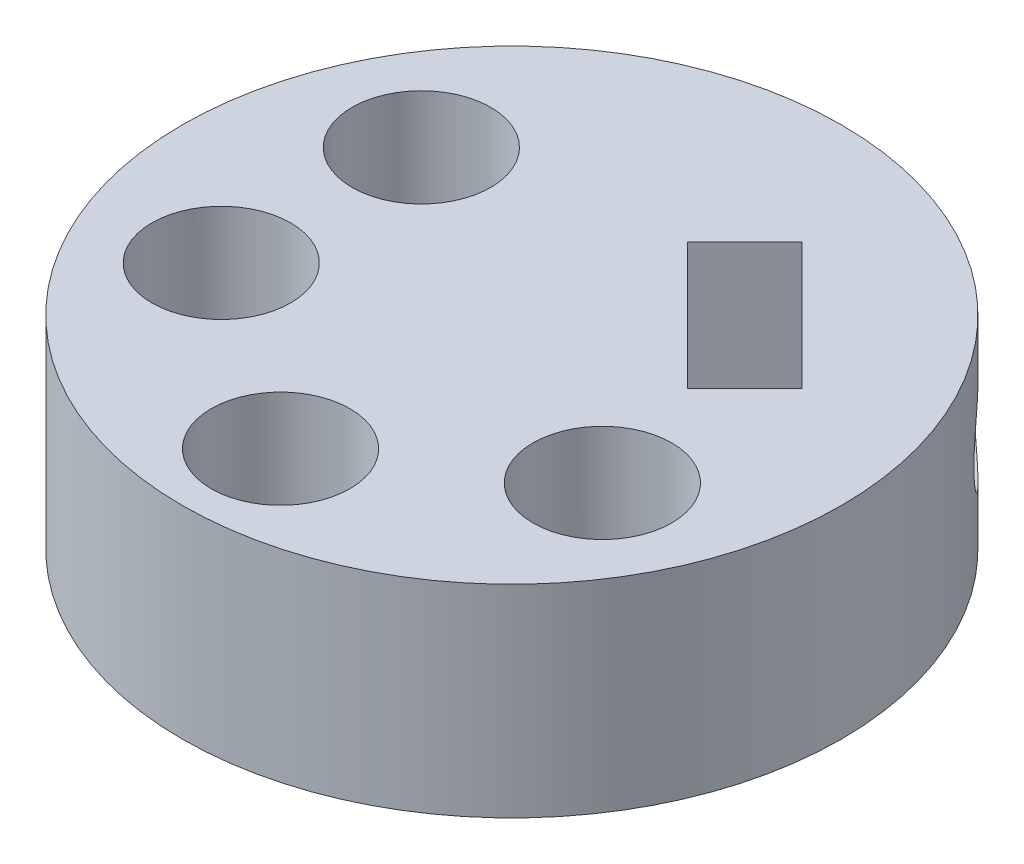
ISO-10303-21;
HEADER;
FILE_DESCRIPTION(('STEP AP214'),'2;1');
FILE_NAME('part.step','',(''),(''),'','','');
FILE_SCHEMA(('AUTOMOTIVE_DESIGN { 1 0 10303 214 1 1 1 1 }'));
ENDSEC;
DATA;
#1=APPLICATION_CONTEXT('core data for automotive mechanical design processes');
#2=APPLICATION_PROTOCOL_DEFINITION('international standard','automotive_design',2000,#1);
#3=PRODUCT_CONTEXT('',#1,'mechanical');
#4=PRODUCT('Part','Part','',(#3));
#5=PRODUCT_RELATED_PRODUCT_CATEGORY('part','',(#4));
#6=PRODUCT_DEFINITION_FORMATION('','',#4);
#7=PRODUCT_DEFINITION_CONTEXT('part definition',#1,'design');
#8=PRODUCT_DEFINITION('design','',#6,#7);
#9=PRODUCT_DEFINITION_SHAPE('','',#8);
#10=(LENGTH_UNIT() NAMED_UNIT(*) SI_UNIT(.MILLI.,.METRE.));
#11=(NAMED_UNIT(*) PLANE_ANGLE_UNIT() SI_UNIT($,.RADIAN.));
#12=(NAMED_UNIT(*) SI_UNIT($,.STERADIAN.) SOLID_ANGLE_UNIT());
#13=UNCERTAINTY_MEASURE_WITH_UNIT(LENGTH_MEASURE(1.E-05),#10,'distance_accuracy_value','');
#14=(GEOMETRIC_REPRESENTATION_CONTEXT(3) GLOBAL_UNCERTAINTY_ASSIGNED_CONTEXT((#13)) GLOBAL_UNIT_ASSIGNED_CONTEXT((#10,
#11,#12)) REPRESENTATION_CONTEXT('',''));
#15=CARTESIAN_POINT('',(0.,0.,0.));
#16=DIRECTION('',(0.,0.,1.));
#17=DIRECTION('',(1.,0.,0.));
#18=AXIS2_PLACEMENT_3D('',#15,#16,#17);
#19=CARTESIAN_POINT('',(0.,7.,0.));
#20=DIRECTION('',(0.,-1.,0.));
#21=DIRECTION('',(0.,0.,-1.));
#22=AXIS2_PLACEMENT_3D('',#19,#20,#21);
#23=CYLINDRICAL_SURFACE('',#22,11.4);
#24=CARTESIAN_POINT('',(0.,7.,0.));
#25=DIRECTION('',(0.,1.,0.));
#26=DIRECTION('',(0.,0.,1.));
#27=AXIS2_PLACEMENT_3D('',#24,#25,#26);
#28=CIRCLE('',#27,11.4);
#29=CARTESIAN_POINT('',(0.,7.,11.4));
#30=VERTEX_POINT('',#29);
#31=EDGE_CURVE('E44',#30,#30,#28,.T.);
#32=ORIENTED_EDGE('',*,*,#31,.F.);
#33=EDGE_LOOP('',(#32));
#34=FACE_BOUND('',#33,.T.);
#35=CARTESIAN_POINT('',(0.,0.,0.));
#36=DIRECTION('',(0.,1.,0.));
#37=DIRECTION('',(0.,0.,1.));
#38=AXIS2_PLACEMENT_3D('',#35,#36,#37);
#39=CIRCLE('',#38,11.4);
#40=CARTESIAN_POINT('',(0.,0.,11.4));
#41=VERTEX_POINT('',#40);
#42=EDGE_CURVE('E144',#41,#41,#39,.T.);
#43=ORIENTED_EDGE('',*,*,#42,.T.);
#44=EDGE_LOOP('',(#43));
#45=FACE_BOUND('',#44,.T.);
#46=CARTESIAN_POINT('',(9.05159253290014,3.5,-6.9302721893405));
#47=CARTESIAN_POINT('',(9.05159091847496,3.41613655358143,-6.93027558480712));
#48=CARTESIAN_POINT('',(9.04726983660078,3.33222160706658,-6.9359293469926));
#49=CARTESIAN_POINT('',(9.03004610210006,3.16672973025324,-6.9583374025146));
#50=CARTESIAN_POINT('',(9.01713462882855,3.08515529309842,-6.97510310556428));
#51=CARTESIAN_POINT('',(8.98295479463834,2.92676429581512,-7.01906642155657));
#52=CARTESIAN_POINT('',(8.96169228739024,2.84994444651783,-7.04625672703986));
#53=CARTESIAN_POINT('',(8.91117771226029,2.70315790664436,-7.11003226333646));
#54=CARTESIAN_POINT('',(8.88192694447024,2.6331901034109,-7.14661596531379));
#55=CARTESIAN_POINT('',(8.81576454481025,2.50164739761795,-7.22807415121351));
#56=CARTESIAN_POINT('',(8.77881145435356,2.44012103313957,-7.27299335206226));
#57=CARTESIAN_POINT('',(8.69803587209957,2.32762732792228,-7.36940424984137));
#58=CARTESIAN_POINT('',(8.65421303016286,2.27666052569366,-7.42089628175275));
#59=CARTESIAN_POINT('',(8.56041863023652,2.18655724547279,-7.52890160341992));
#60=CARTESIAN_POINT('',(8.51042508085664,2.14746490443057,-7.58543264027919));
#61=CARTESIAN_POINT('',(8.4055514761673,2.08250306353681,-7.70148127732598));
#62=CARTESIAN_POINT('',(8.35067162111511,2.05663302208345,-7.76099875507549));
#63=CARTESIAN_POINT('',(8.23772806990656,2.01899573287759,-7.88077211519033));
#64=CARTESIAN_POINT('',(8.17968467131051,2.00714761293946,-7.94102171820398));
#65=CARTESIAN_POINT('',(8.0616988426531,1.99763973863863,-8.06077385456071));
#66=CARTESIAN_POINT('',(8.00175649501416,1.99997936930444,-8.12027642017227));
#67=CARTESIAN_POINT('',(7.88208783425085,2.01871601511722,-8.23648027403859));
#68=CARTESIAN_POINT('',(7.82236247607553,2.03502604748125,-8.29319660439726));
#69=CARTESIAN_POINT('',(7.70456614628883,2.08110440427941,-8.40274564385622));
#70=CARTESIAN_POINT('',(7.64649520899176,2.11087300764187,-8.45557827244057));
#71=CARTESIAN_POINT('',(7.53367293162005,2.1831151312878,-8.55625570602068));
#72=CARTESIAN_POINT('',(7.47893193917763,2.22562604118072,-8.60408526559659));
#73=CARTESIAN_POINT('',(7.37475119326877,2.32211882754777,-8.6935474453925));
#74=CARTESIAN_POINT('',(7.32531170924802,2.3761012866405,-8.73517975068283));
#75=CARTESIAN_POINT('',(7.23306652608383,2.49449135221085,-8.8117180800022));
#76=CARTESIAN_POINT('',(7.19031389126532,2.55897480109748,-8.84657078694514));
#77=CARTESIAN_POINT('',(7.11343202254933,2.69627657141711,-8.9085088478789));
#78=CARTESIAN_POINT('',(7.07930282122379,2.76909492433073,-8.93559417253126));
#79=CARTESIAN_POINT('',(7.02093144062578,2.92106927246061,-8.9815315391548));
#80=CARTESIAN_POINT('',(6.99669423384223,3.00022843120364,-9.00037944069028));
#81=CARTESIAN_POINT('',(6.95908008972639,3.16260063688995,-9.02949474195526));
#82=CARTESIAN_POINT('',(6.945702570273,3.24581346628738,-9.03976260160894));
#83=CARTESIAN_POINT('',(6.93040178829282,3.4132653376371,-9.05149848798732));
#84=CARTESIAN_POINT('',(6.92839370876661,3.49749207039499,-9.05303167664478));
#85=CARTESIAN_POINT('',(6.93568480057464,3.66516386773742,-9.04744696625406));
#86=CARTESIAN_POINT('',(6.94498370413855,3.74860895078572,-9.04032927207483));
#87=CARTESIAN_POINT('',(6.97446063828485,3.91202830719241,-9.01760718911021));
#88=CARTESIAN_POINT('',(6.99459758152611,3.99201446415777,-9.00203485020377));
#89=CARTESIAN_POINT('',(7.04494519242043,4.14661795444828,-8.96268721018388));
#90=CARTESIAN_POINT('',(7.07515624995963,4.22123507984646,-8.93891159158769));
#91=CARTESIAN_POINT('',(7.14473007808337,4.3634611276858,-8.88340118756214));
#92=CARTESIAN_POINT('',(7.18414524051834,4.43102659866182,-8.85162075224688));
#93=CARTESIAN_POINT('',(7.27060718159523,4.55678723735425,-8.78073962346713));
#94=CARTESIAN_POINT('',(7.31765428987619,4.61498200011459,-8.74163861380112));
#95=CARTESIAN_POINT('',(7.41806831359355,4.72072387317372,-8.65659346363933));
#96=CARTESIAN_POINT('',(7.47147340000758,4.76820114914965,-8.61060751549677));
#97=CARTESIAN_POINT('',(7.58255371286342,4.85067631927852,-8.51295133444978));
#98=CARTESIAN_POINT('',(7.64022884534603,4.88567448792646,-8.46128122660892));
#99=CARTESIAN_POINT('',(7.75778931407933,4.94208356799221,-8.35362397232892));
#100=CARTESIAN_POINT('',(7.8176676201069,4.96353430028569,-8.29765002567945));
#101=CARTESIAN_POINT('',(7.9379157843879,4.99236899093024,-8.18268952133261));
#102=CARTESIAN_POINT('',(7.9982856178034,4.99975365569299,-8.12370311507668));
#103=CARTESIAN_POINT('',(8.11726312590987,5.0002323942286,-8.00481476719155));
#104=CARTESIAN_POINT('',(8.17588066366004,4.99343394089013,-7.94492310021061));
#105=CARTESIAN_POINT('',(8.2902104910731,4.96596772302318,-7.82555064296877));
#106=CARTESIAN_POINT('',(8.34592278434432,4.94529997572088,-7.76606985219764));
#107=CARTESIAN_POINT('',(8.45300523151407,4.89071671102614,-7.64937751446562));
#108=CARTESIAN_POINT('',(8.50437724915076,4.85680691537203,-7.59216499915388));
#109=CARTESIAN_POINT('',(8.60162535289329,4.77671329964869,-7.48180843129918));
#110=CARTESIAN_POINT('',(8.64750134524512,4.73052927024253,-7.4286644481649));
#111=CARTESIAN_POINT('',(8.73311202743531,4.62680263362888,-7.3278351071094));
#112=CARTESIAN_POINT('',(8.77279982765575,4.56918017681008,-7.28019207533688));
#113=CARTESIAN_POINT('',(8.84487229692681,4.44437917781099,-7.19245899194787));
#114=CARTESIAN_POINT('',(8.87725523892188,4.37719838190403,-7.1523707268396));
#115=CARTESIAN_POINT('',(8.93424258281471,4.2348554249973,-7.08105983089272));
#116=CARTESIAN_POINT('',(8.95881311120705,4.15966034529438,-7.04987586577567));
#117=CARTESIAN_POINT('',(8.99953490319017,4.00369548074757,-6.99781919890452));
#118=CARTESIAN_POINT('',(9.01569522171167,3.92293179797287,-6.97693540864366));
#119=CARTESIAN_POINT('',(9.03552679685597,3.78480251735314,-6.95121705873816));
#120=CARTESIAN_POINT('',(9.0415459419166,3.72830408776817,-6.94337749326108));
#121=CARTESIAN_POINT('',(9.04957934375292,3.61454511070304,-6.93290392172734));
#122=CARTESIAN_POINT('',(9.05159363566489,3.55728456991363,-6.93026987000051));
#123=CARTESIAN_POINT('',(9.05159253290014,3.5,-6.9302721893405));
#124=B_SPLINE_CURVE_WITH_KNOTS('',3,(#46,#47,#48,#49,#50,#51,#52,#53,#54,#55,#56,#57,#58,#59,
#60,#61,#62,#63,#64,#65,#66,#67,#68,#69,#70,#71,#72,#73,#74,#75,#76,#77,#78,#79,#80,#81,#82,#83,
#84,#85,#86,#87,#88,#89,#90,#91,#92,#93,#94,#95,#96,#97,#98,#99,#100,#101,#102,#103,#104,#105,
#106,#107,#108,#109,#110,#111,#112,#113,#114,#115,#116,#117,#118,#119,#120,#121,#122,#123),
.UNSPECIFIED.,.T.,.F.,(4,2,2,2,2,2,2,2,2,2,2,2,2,2,2,2,2,2,2,2,2,2,2,2,2,2,2,2,2,2,2,2,2,2,2,2,
2,2,4),(0.,0.251381043086059,0.50302060431444,0.754484092287202,1.00590667886643,
1.25871923908628,1.51154468891916,1.76529869577428,2.01904230771713,2.27131519481672,
2.52357714716506,2.77427978413757,3.02498761715016,3.27643842334439,3.5279020033094,
3.78126962067335,4.03463819502882,4.28813397581192,4.54161616734654,4.7932048429059,
5.04478756049499,5.29542316993415,5.54606848054282,5.79817688215687,6.05029617573803,
6.30401366278498,6.55772556862479,6.81068820828677,7.06363814358227,7.31467830916664,
7.56571816295019,7.81664966507906,8.06758544711693,8.32033881089727,8.57315186956023,
8.82704659622807,9.08066739628107,9.25237964868446,9.42409039457667),.UNSPECIFIED.);
#125=CARTESIAN_POINT('',(9.05159253290014,3.5,-6.9302721893405));
#126=VERTEX_POINT('',#125);
#127=EDGE_CURVE('E184',#126,#126,#124,.T.);
#128=ORIENTED_EDGE('',*,*,#127,.F.);
#129=EDGE_LOOP('',(#128));
#130=FACE_BOUND('',#129,.T.);
#131=ADVANCED_FACE('F35',(#34,#45,#130),#23,.T.);
#132=CARTESIAN_POINT('',(0.,-4.,0.));
#133=DIRECTION('',(0.,1.,0.));
#134=DIRECTION('',(0.,0.,1.));
#135=AXIS2_PLACEMENT_3D('',#132,#133,#134);
#136=CYLINDRICAL_SURFACE('',#135,2.);
#137=CARTESIAN_POINT('',(0.,6.,0.));
#138=DIRECTION('',(0.,-1.,0.));
#139=DIRECTION('',(0.,0.,-1.));
#140=AXIS2_PLACEMENT_3D('',#137,#138,#139);
#141=CIRCLE('',#140,2.);
#142=CARTESIAN_POINT('',(0.,6.,-2.));
#143=VERTEX_POINT('',#142);
#144=EDGE_CURVE('E113',#143,#143,#141,.T.);
#145=ORIENTED_EDGE('',*,*,#144,.F.);
#146=EDGE_LOOP('',(#145));
#147=FACE_BOUND('',#146,.T.);
#148=CARTESIAN_POINT('',(0.,-2.,0.));
#149=DIRECTION('',(0.,-1.,0.));
#150=DIRECTION('',(0.,0.,-1.));
#151=AXIS2_PLACEMENT_3D('',#148,#149,#150);
#152=CIRCLE('',#151,2.);
#153=CARTESIAN_POINT('',(0.,-2.,-2.));
#154=VERTEX_POINT('',#153);
#155=EDGE_CURVE('E116',#154,#154,#152,.F.);
#156=ORIENTED_EDGE('',*,*,#155,.F.);
#157=EDGE_LOOP('',(#156));
#158=FACE_BOUND('',#157,.T.);
#159=CARTESIAN_POINT('',(-0.125245825086334,3.5,-1.99607451847331));
#160=CARTESIAN_POINT('',(-0.125228816046949,3.56999742342563,-1.99608048320406));
#161=CARTESIAN_POINT('',(-0.117717315842087,3.64004583431192,-1.99659007099343));
#162=CARTESIAN_POINT('',(-0.0890084037695492,3.77732985620948,-1.99806439961621));
#163=CARTESIAN_POINT('',(-0.0677701985889207,3.84455644501951,-1.9990304947993));
#164=CARTESIAN_POINT('',(-0.0149108390067836,3.97357984673838,-2.00011493620575));
#165=CARTESIAN_POINT('',(0.016563020339923,4.03543877676246,-2.00024479481793));
#166=CARTESIAN_POINT('',(0.0873686977741222,4.15434545444519,-1.99840475194135));
#167=CARTESIAN_POINT('',(0.126699566034246,4.21139378246922,-1.99643510413554));
#168=CARTESIAN_POINT('',(0.220174689159699,4.33211279631659,-1.98850605208671));
#169=CARTESIAN_POINT('',(0.275696196789394,4.39466793422648,-1.98179741318454));
#170=CARTESIAN_POINT('',(0.393063458137065,4.51252546624227,-1.96190142873548));
#171=CARTESIAN_POINT('',(0.454918470369642,4.56781696482027,-1.94870448816959));
#172=CARTESIAN_POINT('',(0.59610207011124,4.68085873865547,-1.91076941171501));
#173=CARTESIAN_POINT('',(0.676419706759292,4.73680596671986,-1.88422496597211));
#174=CARTESIAN_POINT('',(0.839787154000621,4.83462220828284,-1.8172770228746));
#175=CARTESIAN_POINT('',(0.922830032668427,4.87652429746881,-1.77690654544456));
#176=CARTESIAN_POINT('',(1.06240924701474,4.93320768590294,-1.69579169489921));
#177=CARTESIAN_POINT('',(1.11938613914939,4.95235709597847,-1.65883231593822));
#178=CARTESIAN_POINT('',(1.23072200434734,4.98139011599675,-1.57798583471889));
#179=CARTESIAN_POINT('',(1.28508321280617,4.99128177610674,-1.53410479014091));
#180=CARTESIAN_POINT('',(1.38949923508118,5.00122173386249,-1.44022013548301));
#181=CARTESIAN_POINT('',(1.43954252303833,5.00124445437644,-1.39020095250482));
#182=CARTESIAN_POINT('',(1.53361435599959,4.99138206321971,-1.28567986952804));
#183=CARTESIAN_POINT('',(1.57764150542561,4.98149465709186,-1.23117693410424));
#184=CARTESIAN_POINT('',(1.65731897614091,4.95291894941013,-1.12148873964273));
#185=CARTESIAN_POINT('',(1.69320455524055,4.93454367361292,-1.06639078392789));
#186=CARTESIAN_POINT('',(1.75822332480261,4.89000435781776,-0.955401883755456));
#187=CARTESIAN_POINT('',(1.78735504044665,4.86383861948684,-0.899510768920694));
#188=CARTESIAN_POINT('',(1.84189110542738,4.80147038485469,-0.782338373366854));
#189=CARTESIAN_POINT('',(1.86655032947433,4.76448790338124,-0.721128723766489));
#190=CARTESIAN_POINT('',(1.9086044337295,4.68326629602949,-0.601068888678106));
#191=CARTESIAN_POINT('',(1.92599307834044,4.6390209863001,-0.542220767489013));
#192=CARTESIAN_POINT('',(1.95728550142884,4.53477665117906,-0.417090905917004));
#193=CARTESIAN_POINT('',(1.96983083943625,4.4733907899736,-0.351624140685937));
#194=CARTESIAN_POINT('',(1.98786690581766,4.34216541637805,-0.228572851990609));
#195=CARTESIAN_POINT('',(1.99335427884002,4.27232190047494,-0.17099208914012));
#196=CARTESIAN_POINT('',(1.99893877369124,4.13901812975437,-0.077401460987198));
#197=CARTESIAN_POINT('',(1.99988512472963,4.07701295469935,-0.0393768881167819));
#198=CARTESIAN_POINT('',(2.00009493538965,3.94793471858062,0.026747416034127));
#199=CARTESIAN_POINT('',(1.99936222259319,3.88087352030963,0.0548695521963898));
#200=CARTESIAN_POINT('',(1.9978767244799,3.75631305600168,0.0937788682225791));
#201=CARTESIAN_POINT('',(1.99715669944154,3.69955291788314,0.106897079351604));
#202=CARTESIAN_POINT('',(1.99621440897796,3.58464453382617,0.12329235587443));
#203=CARTESIAN_POINT('',(1.99599150681249,3.52649816009718,0.126582012018883));
#204=CARTESIAN_POINT('',(1.99621999404621,3.4105210082666,0.122912138502517));
#205=CARTESIAN_POINT('',(1.99667163163691,3.35269035419033,0.115948836361109));
#206=CARTESIAN_POINT('',(1.99788598811695,3.23892384755713,0.0926402408059104));
#207=CARTESIAN_POINT('',(1.99864923731491,3.1829914020519,0.0762789342151893));
#208=CARTESIAN_POINT('',(1.99999296694321,3.05366195506113,0.0281866995243321));
#209=CARTESIAN_POINT('',(2.00039810813187,2.98156404608497,-0.0070048396821432));
#210=CARTESIAN_POINT('',(1.99847283633848,2.84369233635988,-0.0880276046897114));
#211=CARTESIAN_POINT('',(1.99613736088773,2.77793048270525,-0.133878394646303));
#212=CARTESIAN_POINT('',(1.98681489110354,2.65065099195188,-0.235031745864318));
#213=CARTESIAN_POINT('',(1.97966559899619,2.58936712378174,-0.29061221642324));
#214=CARTESIAN_POINT('',(1.95889840514673,2.47399790363875,-0.40775272485017));
#215=CARTESIAN_POINT('',(1.94527735476879,2.41991607201106,-0.469315661694189));
#216=CARTESIAN_POINT('',(1.90624443987176,2.30872300837063,-0.610493164099597));
#217=CARTESIAN_POINT('',(1.87890859152955,2.2535247611424,-0.691115894169927));
#218=CARTESIAN_POINT('',(1.81025180953124,2.15737926654913,-0.854877556836812));
#219=CARTESIAN_POINT('',(1.76896153244335,2.11640117541871,-0.938010612995397));
#220=CARTESIAN_POINT('',(1.68641412370468,2.06156200855313,-1.07723362514677));
#221=CARTESIAN_POINT('',(1.64897643444367,2.04324320672456,-1.13384906327599));
#222=CARTESIAN_POINT('',(1.567278931434,2.01587120369248,-1.24432280791735));
#223=CARTESIAN_POINT('',(1.52302525795132,2.00680971845149,-1.2981835384374));
#224=CARTESIAN_POINT('',(1.42855600233455,1.9984836090714,-1.40147719832668));
#225=CARTESIAN_POINT('',(1.37832669793597,1.99924198265176,-1.45089946056877));
#226=CARTESIAN_POINT('',(1.27355518949044,2.01056099130124,-1.54368272342466));
#227=CARTESIAN_POINT('',(1.2190118400218,2.02112423770748,-1.58704210576838));
#228=CARTESIAN_POINT('',(1.10910552389624,2.05097491616724,-1.66562958182513));
#229=CARTESIAN_POINT('',(1.05381231736778,2.07000018132155,-1.70105718715034));
#230=CARTESIAN_POINT('',(0.942549200572796,2.11578806561894,-1.76514256068928));
#231=CARTESIAN_POINT('',(0.886579148011496,2.14255233983092,-1.7937988784069));
#232=CARTESIAN_POINT('',(0.769069645686687,2.20627793759597,-1.84747494323911));
#233=CARTESIAN_POINT('',(0.707617517599775,2.24405093135959,-1.87171501830846));
#234=CARTESIAN_POINT('',(0.58720993146144,2.32686644055422,-1.91291467177125));
#235=CARTESIAN_POINT('',(0.528256831535114,2.37191563728605,-1.92986750583851));
#236=CARTESIAN_POINT('',(0.403008243576639,2.4780053665608,-1.96023246473189));
#237=CARTESIAN_POINT('',(0.337567339423564,2.54044639943991,-1.97228071818695));
#238=CARTESIAN_POINT('',(0.214895612958091,2.67386807189988,-1.98938366437798));
#239=CARTESIAN_POINT('',(0.157667801797531,2.74485182603657,-1.99443579798034));
#240=CARTESIAN_POINT('',(0.066140153062407,2.87888325059031,-1.99931311842522));
#241=CARTESIAN_POINT('',(0.0295577611532969,2.94033498270656,-2.00003138755796));
#242=CARTESIAN_POINT('',(-0.0337490284660993,3.06808291305589,-1.99996641387897));
#243=CARTESIAN_POINT('',(-0.0604995738005172,3.13436569159546,-1.99918718855739));
#244=CARTESIAN_POINT('',(-0.0952093427142979,3.25078821959693,-1.99778511998958));
#245=CARTESIAN_POINT('',(-0.106377983930113,3.29996707129047,-1.99718335905785));
#246=CARTESIAN_POINT('',(-0.121399936592211,3.39942233303366,-1.99632602865974));
#247=CARTESIAN_POINT('',(-0.125258048231719,3.44969800094373,-1.99607023206009));
#248=CARTESIAN_POINT('',(-0.125245825086334,3.5,-1.99607451847331));
#249=B_SPLINE_CURVE_WITH_KNOTS('',3,(#159,#160,#161,#162,#163,#164,#165,#166,#167,#168,#169,
#170,#171,#172,#173,#174,#175,#176,#177,#178,#179,#180,#181,#182,#183,#184,#185,#186,#187,#188,
#189,#190,#191,#192,#193,#194,#195,#196,#197,#198,#199,#200,#201,#202,#203,#204,#205,#206,#207,
#208,#209,#210,#211,#212,#213,#214,#215,#216,#217,#218,#219,#220,#221,#222,#223,#224,#225,#226,
#227,#228,#229,#230,#231,#232,#233,#234,#235,#236,#237,#238,#239,#240,#241,#242,#243,#244,#245,
#246,#247,#248),.UNSPECIFIED.,.T.,.F.,(4,2,2,2,2,2,2,2,2,2,2,2,2,2,2,2,2,2,2,2,2,2,2,2,2,2,2,2,
2,2,2,2,2,2,2,2,2,2,2,2,2,2,2,2,4),(0.,0.20973177668449,0.420089722582995,0.627545385620139,
0.834975984672346,1.08585208691169,1.33710031031849,1.63964848103538,1.94147907444963,
2.15227725277555,2.36289195870711,2.57405250727807,2.78526195641289,2.9892375589505,
3.19325766108669,3.41936844116895,3.64567274887663,3.91649517204702,4.18744629647933,
4.40499409477197,4.62204646613006,4.79608005545901,4.96989060538193,5.14376512326213,
5.31793678696019,5.55730028202398,5.79710662639151,6.04543209090061,6.29387849446619,
6.59652499511463,6.89851088586565,7.10852896194427,7.31835893539181,7.52868041101044,
7.73905791773945,7.94332812691912,8.14764205379333,8.3751005248961,8.60276905744645,
8.87547580578155,9.14828228208531,9.36218279640836,9.57551025772699,9.72632812073766,
9.87704692032409),.UNSPECIFIED.);
#250=CARTESIAN_POINT('',(-0.125245825086334,3.5,-1.99607451847331));
#251=VERTEX_POINT('',#250);
#252=EDGE_CURVE('E162',#251,#251,#249,.T.);
#253=ORIENTED_EDGE('',*,*,#252,.T.);
#254=EDGE_LOOP('',(#253));
#255=FACE_BOUND('',#254,.T.);
#256=ADVANCED_FACE('F154',(#147,#158,#255),#136,.F.);
#257=CARTESIAN_POINT('',(0.,7.,0.));
#258=DIRECTION('',(0.,1.,0.));
#259=DIRECTION('',(0.,0.,1.));
#260=AXIS2_PLACEMENT_3D('',#257,#258,#259);
#261=PLANE('',#260);
#262=ORIENTED_EDGE('',*,*,#31,.T.);
#263=EDGE_LOOP('',(#262));
#264=FACE_BOUND('',#263,.T.);
#265=CARTESIAN_POINT('',(6.59,7.,3.46));
#266=DIRECTION('',(0.,1.,0.));
#267=DIRECTION('',(0.,0.,1.));
#268=AXIS2_PLACEMENT_3D('',#265,#266,#267);
#269=CIRCLE('',#268,2.4);
#270=CARTESIAN_POINT('',(6.59,7.,5.86));
#271=VERTEX_POINT('',#270);
#272=EDGE_CURVE('E141',#271,#271,#269,.T.);
#273=ORIENTED_EDGE('',*,*,#272,.F.);
#274=EDGE_LOOP('',(#273));
#275=FACE_BOUND('',#274,.T.);
#276=CARTESIAN_POINT('',(-6.59,7.,3.46));
#277=DIRECTION('',(0.,1.,0.));
#278=DIRECTION('',(0.,0.,1.));
#279=AXIS2_PLACEMENT_3D('',#276,#277,#278);
#280=CIRCLE('',#279,2.4);
#281=CARTESIAN_POINT('',(-6.59,7.,5.86));
#282=VERTEX_POINT('',#281);
#283=EDGE_CURVE('E124',#282,#282,#280,.T.);
#284=ORIENTED_EDGE('',*,*,#283,.F.);
#285=EDGE_LOOP('',(#284));
#286=FACE_BOUND('',#285,.T.);
#287=CARTESIAN_POINT('',(0.,7.,8.));
#288=DIRECTION('',(0.,1.,0.));
#289=DIRECTION('',(0.,0.,1.));
#290=AXIS2_PLACEMENT_3D('',#287,#288,#289);
#291=CIRCLE('',#290,2.4);
#292=CARTESIAN_POINT('',(0.,7.,10.4));
#293=VERTEX_POINT('',#292);
#294=EDGE_CURVE('E132',#293,#293,#291,.T.);
#295=ORIENTED_EDGE('',*,*,#294,.F.);
#296=EDGE_LOOP('',(#295));
#297=FACE_BOUND('',#296,.T.);
#298=CARTESIAN_POINT('',(-6.59,7.,-3.46));
#299=DIRECTION('',(0.,1.,0.));
#300=DIRECTION('',(0.,0.,1.));
#301=AXIS2_PLACEMENT_3D('',#298,#299,#300);
#302=CIRCLE('',#301,2.4);
#303=CARTESIAN_POINT('',(-6.59,7.,-1.06));
#304=VERTEX_POINT('',#303);
#305=EDGE_CURVE('E135',#304,#304,#302,.F.);
#306=ORIENTED_EDGE('',*,*,#305,.T.);
#307=EDGE_LOOP('',(#306));
#308=FACE_BOUND('',#307,.T.);
#309=DIRECTION('',(-0.707106781186548,0.,0.707106781186548));
#310=VECTOR('',#309,1.);
#311=CARTESIAN_POINT('',(-2.1920310216783,7.,-2.1920310216783));
#312=LINE('',#311,#310);
#313=CARTESIAN_POINT('',(2.82842712474619,7.,-7.21248916810279));
#314=VERTEX_POINT('',#313);
#315=CARTESIAN_POINT('',(0.848528137423858,7.,-5.23259018078045));
#316=VERTEX_POINT('',#315);
#317=EDGE_CURVE('E108',#314,#316,#312,.T.);
#318=ORIENTED_EDGE('',*,*,#317,.F.);
#319=DIRECTION('',(0.707106781186547,0.,0.707106781186548));
#320=VECTOR('',#319,1.);
#321=CARTESIAN_POINT('',(5.02045814642449,7.,-5.02045814642449));
#322=LINE('',#321,#320);
#323=CARTESIAN_POINT('',(7.21248916810278,7.,-2.82842712474619));
#324=VERTEX_POINT('',#323);
#325=EDGE_CURVE('E110',#314,#324,#322,.T.);
#326=ORIENTED_EDGE('',*,*,#325,.T.);
#327=DIRECTION('',(-0.707106781186548,0.,0.707106781186548));
#328=VECTOR('',#327,1.);
#329=CARTESIAN_POINT('',(2.1920310216783,7.,2.1920310216783));
#330=LINE('',#329,#328);
#331=CARTESIAN_POINT('',(5.23259018078045,7.,-0.848528137423858));
#332=VERTEX_POINT('',#331);
#333=EDGE_CURVE('E103',#324,#332,#330,.T.);
#334=ORIENTED_EDGE('',*,*,#333,.T.);
#335=DIRECTION('',(-0.707106781186548,0.,-0.707106781186548));
#336=VECTOR('',#335,1.);
#337=CARTESIAN_POINT('',(3.04055915910215,7.,-3.04055915910215));
#338=LINE('',#337,#336);
#339=EDGE_CURVE('E84',#332,#316,#338,.T.);
#340=ORIENTED_EDGE('',*,*,#339,.T.);
#341=EDGE_LOOP('',(#318,#326,#334,#340));
#342=FACE_BOUND('',#341,.T.);
#343=ADVANCED_FACE('F157',(#264,#275,#286,#297,#308,#342),#261,.T.);
#344=CARTESIAN_POINT('',(0.,0.,0.));
#345=DIRECTION('',(0.,1.,0.));
#346=DIRECTION('',(0.,0.,1.));
#347=AXIS2_PLACEMENT_3D('',#344,#345,#346);
#348=PLANE('',#347);
#349=CARTESIAN_POINT('',(-6.59,0.,-3.46));
#350=DIRECTION('',(0.,1.,0.));
#351=DIRECTION('',(0.,0.,1.));
#352=AXIS2_PLACEMENT_3D('',#349,#350,#351);
#353=CIRCLE('',#352,2.4);
#354=CARTESIAN_POINT('',(-6.59,0.,-1.06));
#355=VERTEX_POINT('',#354);
#356=EDGE_CURVE('E121',#355,#355,#353,.T.);
#357=ORIENTED_EDGE('',*,*,#356,.T.);
#358=EDGE_LOOP('',(#357));
#359=FACE_BOUND('',#358,.T.);
#360=ORIENTED_EDGE('',*,*,#42,.F.);
#361=EDGE_LOOP('',(#360));
#362=FACE_BOUND('',#361,.T.);
#363=CARTESIAN_POINT('',(6.59,0.,3.46));
#364=DIRECTION('',(0.,-1.,0.));
#365=DIRECTION('',(0.,0.,-1.));
#366=AXIS2_PLACEMENT_3D('',#363,#364,#365);
#367=CIRCLE('',#366,2.4);
#368=CARTESIAN_POINT('',(6.59,0.,1.06));
#369=VERTEX_POINT('',#368);
#370=EDGE_CURVE('E138',#369,#369,#367,.T.);
#371=ORIENTED_EDGE('',*,*,#370,.F.);
#372=EDGE_LOOP('',(#371));
#373=FACE_BOUND('',#372,.T.);
#374=CARTESIAN_POINT('',(-6.59,0.,3.46));
#375=DIRECTION('',(0.,-1.,0.));
#376=DIRECTION('',(0.,0.,-1.));
#377=AXIS2_PLACEMENT_3D('',#374,#375,#376);
#378=CIRCLE('',#377,2.4);
#379=CARTESIAN_POINT('',(-6.59,0.,1.06));
#380=VERTEX_POINT('',#379);
#381=EDGE_CURVE('E120',#380,#380,#378,.T.);
#382=ORIENTED_EDGE('',*,*,#381,.F.);
#383=EDGE_LOOP('',(#382));
#384=FACE_BOUND('',#383,.T.);
#385=CARTESIAN_POINT('',(0.,0.,8.));
#386=DIRECTION('',(0.,-1.,0.));
#387=DIRECTION('',(0.,0.,-1.));
#388=AXIS2_PLACEMENT_3D('',#385,#386,#387);
#389=CIRCLE('',#388,2.4);
#390=CARTESIAN_POINT('',(0.,0.,5.6));
#391=VERTEX_POINT('',#390);
#392=EDGE_CURVE('E125',#391,#391,#389,.T.);
#393=ORIENTED_EDGE('',*,*,#392,.F.);
#394=EDGE_LOOP('',(#393));
#395=FACE_BOUND('',#394,.T.);
#396=CARTESIAN_POINT('',(0.,0.,0.));
#397=DIRECTION('',(0.,1.,0.));
#398=DIRECTION('',(0.,0.,1.));
#399=AXIS2_PLACEMENT_3D('',#396,#397,#398);
#400=CIRCLE('',#399,3.9);
#401=CARTESIAN_POINT('',(0.,0.,3.9));
#402=VERTEX_POINT('',#401);
#403=EDGE_CURVE('E11',#402,#402,#400,.F.);
#404=ORIENTED_EDGE('',*,*,#403,.F.);
#405=EDGE_LOOP('',(#404));
#406=FACE_BOUND('',#405,.T.);
#407=DIRECTION('',(-0.707106781186547,0.,-0.707106781186548));
#408=VECTOR('',#407,1.);
#409=CARTESIAN_POINT('',(5.02045814642449,0.,-5.02045814642449));
#410=LINE('',#409,#408);
#411=CARTESIAN_POINT('',(7.21248916810278,0.,-2.82842712474619));
#412=VERTEX_POINT('',#411);
#413=CARTESIAN_POINT('',(2.82842712474619,0.,-7.21248916810279));
#414=VERTEX_POINT('',#413);
#415=EDGE_CURVE('E60',#412,#414,#410,.T.);
#416=ORIENTED_EDGE('',*,*,#415,.T.);
#417=DIRECTION('',(0.707106781186548,0.,-0.707106781186548));
#418=VECTOR('',#417,1.);
#419=CARTESIAN_POINT('',(-2.1920310216783,0.,-2.1920310216783));
#420=LINE('',#419,#418);
#421=CARTESIAN_POINT('',(0.848528137423858,0.,-5.23259018078045));
#422=VERTEX_POINT('',#421);
#423=EDGE_CURVE('E96',#422,#414,#420,.T.);
#424=ORIENTED_EDGE('',*,*,#423,.F.);
#425=DIRECTION('',(0.707106781186548,0.,0.707106781186548));
#426=VECTOR('',#425,1.);
#427=CARTESIAN_POINT('',(3.04055915910215,0.,-3.04055915910215));
#428=LINE('',#427,#426);
#429=CARTESIAN_POINT('',(5.23259018078045,0.,-0.848528137423858));
#430=VERTEX_POINT('',#429);
#431=EDGE_CURVE('E81',#422,#430,#428,.T.);
#432=ORIENTED_EDGE('',*,*,#431,.T.);
#433=DIRECTION('',(0.707106781186548,0.,-0.707106781186548));
#434=VECTOR('',#433,1.);
#435=CARTESIAN_POINT('',(2.1920310216783,0.,2.1920310216783));
#436=LINE('',#435,#434);
#437=EDGE_CURVE('E90',#430,#412,#436,.T.);
#438=ORIENTED_EDGE('',*,*,#437,.T.);
#439=EDGE_LOOP('',(#416,#424,#432,#438));
#440=FACE_BOUND('',#439,.T.);
#441=ADVANCED_FACE('F94',(#359,#362,#373,#384,#395,#406,#440),#348,.F.);
#442=CARTESIAN_POINT('',(6.59,15.,3.46));
#443=DIRECTION('',(0.,-1.,0.));
#444=DIRECTION('',(0.,0.,-1.));
#445=AXIS2_PLACEMENT_3D('',#442,#443,#444);
#446=CYLINDRICAL_SURFACE('',#445,2.4);
#447=ORIENTED_EDGE('',*,*,#272,.T.);
#448=EDGE_LOOP('',(#447));
#449=FACE_BOUND('',#448,.T.);
#450=ORIENTED_EDGE('',*,*,#370,.T.);
#451=EDGE_LOOP('',(#450));
#452=FACE_BOUND('',#451,.T.);
#453=ADVANCED_FACE('F209',(#449,#452),#446,.F.);
#454=CARTESIAN_POINT('',(-6.59,15.,3.46));
#455=DIRECTION('',(0.,-1.,0.));
#456=DIRECTION('',(0.,0.,-1.));
#457=AXIS2_PLACEMENT_3D('',#454,#455,#456);
#458=CYLINDRICAL_SURFACE('',#457,2.4);
#459=ORIENTED_EDGE('',*,*,#283,.T.);
#460=EDGE_LOOP('',(#459));
#461=FACE_BOUND('',#460,.T.);
#462=ORIENTED_EDGE('',*,*,#381,.T.);
#463=EDGE_LOOP('',(#462));
#464=FACE_BOUND('',#463,.T.);
#465=ADVANCED_FACE('F237',(#461,#464),#458,.F.);
#466=CARTESIAN_POINT('',(0.,15.,8.));
#467=DIRECTION('',(0.,-1.,0.));
#468=DIRECTION('',(0.,0.,-1.));
#469=AXIS2_PLACEMENT_3D('',#466,#467,#468);
#470=CYLINDRICAL_SURFACE('',#469,2.4);
#471=ORIENTED_EDGE('',*,*,#294,.T.);
#472=EDGE_LOOP('',(#471));
#473=FACE_BOUND('',#472,.T.);
#474=ORIENTED_EDGE('',*,*,#392,.T.);
#475=EDGE_LOOP('',(#474));
#476=FACE_BOUND('',#475,.T.);
#477=ADVANCED_FACE('F230',(#473,#476),#470,.F.);
#478=CARTESIAN_POINT('',(-6.59,15.,-3.46));
#479=DIRECTION('',(0.,-1.,0.));
#480=DIRECTION('',(0.,0.,-1.));
#481=AXIS2_PLACEMENT_3D('',#478,#479,#480);
#482=CYLINDRICAL_SURFACE('',#481,2.4);
#483=ORIENTED_EDGE('',*,*,#305,.F.);
#484=EDGE_LOOP('',(#483));
#485=FACE_BOUND('',#484,.T.);
#486=ORIENTED_EDGE('',*,*,#356,.F.);
#487=EDGE_LOOP('',(#486));
#488=FACE_BOUND('',#487,.T.);
#489=ADVANCED_FACE('F221',(#485,#488),#482,.F.);
#490=CARTESIAN_POINT('',(0.,-2.,0.));
#491=DIRECTION('',(0.,1.,0.));
#492=DIRECTION('',(0.,0.,1.));
#493=AXIS2_PLACEMENT_3D('',#490,#491,#492);
#494=CYLINDRICAL_SURFACE('',#493,3.9);
#495=CARTESIAN_POINT('',(0.,-2.,0.));
#496=DIRECTION('',(0.,-1.,0.));
#497=DIRECTION('',(0.,0.,-1.));
#498=AXIS2_PLACEMENT_3D('',#495,#496,#497);
#499=CIRCLE('',#498,3.9);
#500=CARTESIAN_POINT('',(0.,-2.,-3.9));
#501=VERTEX_POINT('',#500);
#502=EDGE_CURVE('E117',#501,#501,#499,.T.);
#503=ORIENTED_EDGE('',*,*,#502,.F.);
#504=EDGE_LOOP('',(#503));
#505=FACE_BOUND('',#504,.T.);
#506=ORIENTED_EDGE('',*,*,#403,.T.);
#507=EDGE_LOOP('',(#506));
#508=FACE_BOUND('',#507,.T.);
#509=ADVANCED_FACE('F219',(#505,#508),#494,.T.);
#510=CARTESIAN_POINT('',(0.,-2.,0.));
#511=DIRECTION('',(0.,-1.,0.));
#512=DIRECTION('',(0.,0.,-1.));
#513=AXIS2_PLACEMENT_3D('',#510,#511,#512);
#514=PLANE('',#513);
#515=ORIENTED_EDGE('',*,*,#155,.T.);
#516=EDGE_LOOP('',(#515));
#517=FACE_BOUND('',#516,.T.);
#518=ORIENTED_EDGE('',*,*,#502,.T.);
#519=EDGE_LOOP('',(#518));
#520=FACE_BOUND('',#519,.T.);
#521=ADVANCED_FACE('F151',(#517,#520),#514,.T.);
#522=CARTESIAN_POINT('',(0.,6.,0.));
#523=DIRECTION('',(0.,-1.,0.));
#524=DIRECTION('',(0.,0.,-1.));
#525=AXIS2_PLACEMENT_3D('',#522,#523,#524);
#526=PLANE('',#525);
#527=ORIENTED_EDGE('',*,*,#144,.T.);
#528=EDGE_LOOP('',(#527));
#529=FACE_BOUND('',#528,.T.);
#530=ADVANCED_FACE('F228',(#529),#526,.T.);
#531=CARTESIAN_POINT('',(5.02045814642449,10.5,-5.02045814642449));
#532=DIRECTION('',(-0.707106781186548,0.,0.707106781186547));
#533=DIRECTION('',(0.707106781186547,0.,0.707106781186548));
#534=AXIS2_PLACEMENT_3D('',#531,#532,#533);
#535=PLANE('',#534);
#536=CARTESIAN_POINT('',(5.02045814642449,3.5,-5.02045814642449));
#537=DIRECTION('',(-0.707106781186548,0.,0.707106781186547));
#538=DIRECTION('',(0.707106781186547,0.,0.707106781186548));
#539=AXIS2_PLACEMENT_3D('',#536,#537,#538);
#540=CIRCLE('',#539,1.5);
#541=CARTESIAN_POINT('',(6.08111831820431,3.5,-3.95979797464466));
#542=VERTEX_POINT('',#541);
#543=EDGE_CURVE('E166',#542,#542,#540,.F.);
#544=ORIENTED_EDGE('',*,*,#543,.T.);
#545=EDGE_LOOP('',(#544));
#546=FACE_BOUND('',#545,.T.);
#547=DIRECTION('',(0.,-1.,0.));
#548=VECTOR('',#547,1.);
#549=CARTESIAN_POINT('',(2.82842712474619,10.5,-7.21248916810279));
#550=LINE('',#549,#548);
#551=EDGE_CURVE('E101',#314,#414,#550,.T.);
#552=ORIENTED_EDGE('',*,*,#551,.T.);
#553=ORIENTED_EDGE('',*,*,#415,.F.);
#554=DIRECTION('',(0.,-1.,0.));
#555=VECTOR('',#554,1.);
#556=CARTESIAN_POINT('',(7.21248916810278,10.5,-2.82842712474619));
#557=LINE('',#556,#555);
#558=EDGE_CURVE('E87',#324,#412,#557,.T.);
#559=ORIENTED_EDGE('',*,*,#558,.F.);
#560=ORIENTED_EDGE('',*,*,#325,.F.);
#561=EDGE_LOOP('',(#552,#553,#559,#560));
#562=FACE_BOUND('',#561,.T.);
#563=ADVANCED_FACE('F193',(#546,#562),#535,.T.);
#564=CARTESIAN_POINT('',(-2.1920310216783,10.5,-2.1920310216783));
#565=DIRECTION('',(-0.707106781186548,0.,-0.707106781186548));
#566=DIRECTION('',(-0.707106781186548,0.,0.707106781186548));
#567=AXIS2_PLACEMENT_3D('',#564,#565,#566);
#568=PLANE('',#567);
#569=ORIENTED_EDGE('',*,*,#317,.T.);
#570=DIRECTION('',(0.,-1.,0.));
#571=VECTOR('',#570,1.);
#572=CARTESIAN_POINT('',(0.848528137423858,10.5,-5.23259018078045));
#573=LINE('',#572,#571);
#574=EDGE_CURVE('E86',#316,#422,#573,.T.);
#575=ORIENTED_EDGE('',*,*,#574,.T.);
#576=ORIENTED_EDGE('',*,*,#423,.T.);
#577=ORIENTED_EDGE('',*,*,#551,.F.);
#578=EDGE_LOOP('',(#569,#575,#576,#577));
#579=FACE_BOUND('',#578,.T.);
#580=ADVANCED_FACE('F182',(#579),#568,.F.);
#581=CARTESIAN_POINT('',(3.04055915910215,10.5,-3.04055915910215));
#582=DIRECTION('',(0.707106781186548,0.,-0.707106781186548));
#583=DIRECTION('',(-0.707106781186548,0.,-0.707106781186548));
#584=AXIS2_PLACEMENT_3D('',#581,#582,#583);
#585=PLANE('',#584);
#586=CARTESIAN_POINT('',(3.04055915910215,3.5,-3.04055915910215));
#587=DIRECTION('',(0.707106781186548,0.,-0.707106781186548));
#588=DIRECTION('',(-0.707106781186548,0.,-0.707106781186548));
#589=AXIS2_PLACEMENT_3D('',#586,#587,#588);
#590=CIRCLE('',#589,1.5);
#591=CARTESIAN_POINT('',(1.97989898732233,3.5,-4.10121933088197));
#592=VERTEX_POINT('',#591);
#593=EDGE_CURVE('E39',#592,#592,#590,.F.);
#594=ORIENTED_EDGE('',*,*,#593,.T.);
#595=EDGE_LOOP('',(#594));
#596=FACE_BOUND('',#595,.T.);
#597=DIRECTION('',(0.,-1.,0.));
#598=VECTOR('',#597,1.);
#599=CARTESIAN_POINT('',(5.23259018078045,10.5,-0.848528137423858));
#600=LINE('',#599,#598);
#601=EDGE_CURVE('E52',#332,#430,#600,.T.);
#602=ORIENTED_EDGE('',*,*,#601,.T.);
#603=ORIENTED_EDGE('',*,*,#431,.F.);
#604=ORIENTED_EDGE('',*,*,#574,.F.);
#605=ORIENTED_EDGE('',*,*,#339,.F.);
#606=EDGE_LOOP('',(#602,#603,#604,#605));
#607=FACE_BOUND('',#606,.T.);
#608=ADVANCED_FACE('F78',(#596,#607),#585,.T.);
#609=CARTESIAN_POINT('',(2.1920310216783,10.5,2.1920310216783));
#610=DIRECTION('',(-0.707106781186548,0.,-0.707106781186548));
#611=DIRECTION('',(-0.707106781186548,0.,0.707106781186548));
#612=AXIS2_PLACEMENT_3D('',#609,#610,#611);
#613=PLANE('',#612);
#614=ORIENTED_EDGE('',*,*,#558,.T.);
#615=ORIENTED_EDGE('',*,*,#437,.F.);
#616=ORIENTED_EDGE('',*,*,#601,.F.);
#617=ORIENTED_EDGE('',*,*,#333,.F.);
#618=EDGE_LOOP('',(#614,#615,#616,#617));
#619=FACE_BOUND('',#618,.T.);
#620=ADVANCED_FACE('F91',(#619),#613,.T.);
#621=CARTESIAN_POINT('',(11.4,3.5,-11.4));
#622=DIRECTION('',(-0.707106781186548,0.,0.707106781186547));
#623=DIRECTION('',(0.707106781186547,0.,0.707106781186548));
#624=AXIS2_PLACEMENT_3D('',#621,#622,#623);
#625=CYLINDRICAL_SURFACE('',#624,1.5);
#626=ORIENTED_EDGE('',*,*,#593,.F.);
#627=EDGE_LOOP('',(#626));
#628=FACE_BOUND('',#627,.T.);
#629=ORIENTED_EDGE('',*,*,#252,.F.);
#630=EDGE_LOOP('',(#629));
#631=FACE_BOUND('',#630,.T.);
#632=ADVANCED_FACE('F176',(#628,#631),#625,.F.);
#633=ORIENTED_EDGE('',*,*,#543,.F.);
#634=EDGE_LOOP('',(#633));
#635=FACE_BOUND('',#634,.T.);
#636=ORIENTED_EDGE('',*,*,#127,.T.);
#637=EDGE_LOOP('',(#636));
#638=FACE_BOUND('',#637,.T.);
#639=ADVANCED_FACE('F180',(#635,#638),#625,.F.);
#640=CLOSED_SHELL('',(#131,#256,#343,#441,#453,#465,#477,#489,#509,#521,#530,#563,#580,#608,
#620,#632,#639));
#641=MANIFOLD_SOLID_BREP('B2',#640);
#642=ADVANCED_BREP_SHAPE_REPRESENTATION('',(#18,#641),#14);
#643=SHAPE_DEFINITION_REPRESENTATION(#9,#642);
ENDSEC;
END-ISO-10303-21;
